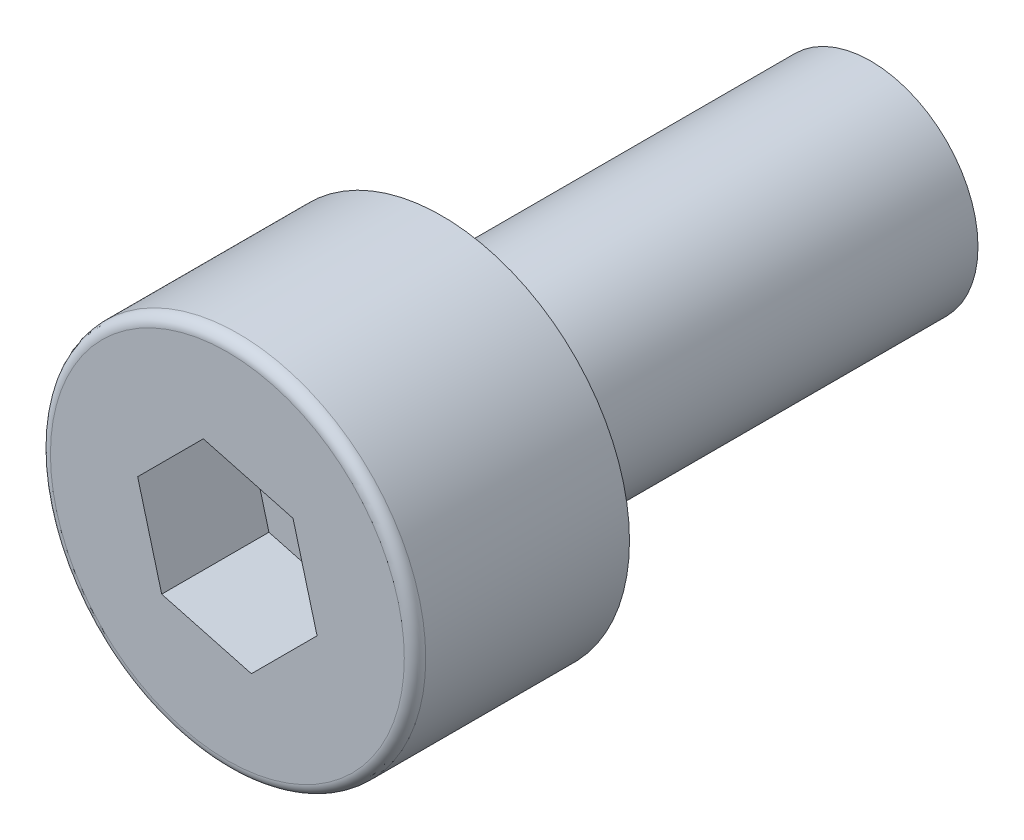
ISO-10303-21;
HEADER;
FILE_DESCRIPTION(('STEP AP214'),'2;1');
FILE_NAME('part.step','',(''),(''),'','','');
FILE_SCHEMA(('AUTOMOTIVE_DESIGN { 1 0 10303 214 1 1 1 1 }'));
ENDSEC;
DATA;
#1=APPLICATION_CONTEXT('core data for automotive mechanical design processes');
#2=APPLICATION_PROTOCOL_DEFINITION('international standard','automotive_design',2000,#1);
#3=PRODUCT_CONTEXT('',#1,'mechanical');
#4=PRODUCT('Part','Part','',(#3));
#5=PRODUCT_RELATED_PRODUCT_CATEGORY('part','',(#4));
#6=PRODUCT_DEFINITION_FORMATION('','',#4);
#7=PRODUCT_DEFINITION_CONTEXT('part definition',#1,'design');
#8=PRODUCT_DEFINITION('design','',#6,#7);
#9=PRODUCT_DEFINITION_SHAPE('','',#8);
#10=(LENGTH_UNIT() NAMED_UNIT(*) SI_UNIT(.MILLI.,.METRE.));
#11=(NAMED_UNIT(*) PLANE_ANGLE_UNIT() SI_UNIT($,.RADIAN.));
#12=(NAMED_UNIT(*) SI_UNIT($,.STERADIAN.) SOLID_ANGLE_UNIT());
#13=UNCERTAINTY_MEASURE_WITH_UNIT(LENGTH_MEASURE(1.E-05),#10,'distance_accuracy_value','');
#14=(GEOMETRIC_REPRESENTATION_CONTEXT(3) GLOBAL_UNCERTAINTY_ASSIGNED_CONTEXT((#13)) GLOBAL_UNIT_ASSIGNED_CONTEXT((#10,
#11,#12)) REPRESENTATION_CONTEXT('',''));
#15=CARTESIAN_POINT('',(0.,0.,0.));
#16=DIRECTION('',(0.,0.,1.));
#17=DIRECTION('',(1.,0.,0.));
#18=AXIS2_PLACEMENT_3D('',#15,#16,#17);
#19=CARTESIAN_POINT('',(0.,0.,0.));
#20=DIRECTION('',(0.,0.,1.));
#21=DIRECTION('',(1.,0.,0.));
#22=AXIS2_PLACEMENT_3D('',#19,#20,#21);
#23=PLANE('',#22);
#24=CARTESIAN_POINT('',(0.,0.,0.));
#25=DIRECTION('',(0.,0.,1.));
#26=DIRECTION('',(1.,0.,0.));
#27=AXIS2_PLACEMENT_3D('',#24,#25,#26);
#28=CIRCLE('',#27,3.5);
#29=CARTESIAN_POINT('',(3.5,0.,0.));
#30=VERTEX_POINT('',#29);
#31=EDGE_CURVE('E138',#30,#30,#28,.T.);
#32=ORIENTED_EDGE('',*,*,#31,.F.);
#33=EDGE_LOOP('',(#32));
#34=FACE_BOUND('',#33,.T.);
#35=CARTESIAN_POINT('',(0.,0.,0.));
#36=DIRECTION('',(0.,0.,1.));
#37=DIRECTION('',(1.,0.,0.));
#38=AXIS2_PLACEMENT_3D('',#35,#36,#37);
#39=CIRCLE('',#38,2.);
#40=CARTESIAN_POINT('',(2.,0.,0.));
#41=VERTEX_POINT('',#40);
#42=EDGE_CURVE('E146',#41,#41,#39,.F.);
#43=ORIENTED_EDGE('',*,*,#42,.F.);
#44=EDGE_LOOP('',(#43));
#45=FACE_BOUND('',#44,.T.);
#46=ADVANCED_FACE('F35',(#34,#45),#23,.F.);
#47=CARTESIAN_POINT('',(0.,0.,4.));
#48=DIRECTION('',(0.,0.,-1.));
#49=DIRECTION('',(-1.,0.,0.));
#50=AXIS2_PLACEMENT_3D('',#47,#48,#49);
#51=CYLINDRICAL_SURFACE('',#50,3.5);
#52=CARTESIAN_POINT('',(0.,0.,3.8));
#53=DIRECTION('',(0.,0.,1.));
#54=DIRECTION('',(1.,0.,0.));
#55=AXIS2_PLACEMENT_3D('',#52,#53,#54);
#56=CIRCLE('',#55,3.5);
#57=CARTESIAN_POINT('',(3.5,0.,3.8));
#58=VERTEX_POINT('',#57);
#59=EDGE_CURVE('E11',#58,#58,#56,.F.);
#60=ORIENTED_EDGE('',*,*,#59,.T.);
#61=EDGE_LOOP('',(#60));
#62=FACE_BOUND('',#61,.T.);
#63=ORIENTED_EDGE('',*,*,#31,.T.);
#64=EDGE_LOOP('',(#63));
#65=FACE_BOUND('',#64,.T.);
#66=ADVANCED_FACE('F165',(#62,#65),#51,.T.);
#67=CARTESIAN_POINT('',(0.,0.,4.));
#68=DIRECTION('',(0.,0.,1.));
#69=DIRECTION('',(1.,0.,0.));
#70=AXIS2_PLACEMENT_3D('',#67,#68,#69);
#71=PLANE('',#70);
#72=CARTESIAN_POINT('',(0.,0.,4.));
#73=DIRECTION('',(0.,0.,1.));
#74=DIRECTION('',(1.,0.,0.));
#75=AXIS2_PLACEMENT_3D('',#72,#73,#74);
#76=CIRCLE('',#75,3.3);
#77=CARTESIAN_POINT('',(3.3,0.,4.));
#78=VERTEX_POINT('',#77);
#79=EDGE_CURVE('E43',#78,#78,#76,.T.);
#80=ORIENTED_EDGE('',*,*,#79,.T.);
#81=EDGE_LOOP('',(#80));
#82=FACE_BOUND('',#81,.T.);
#83=DIRECTION('',(0.258819045102521,-0.965925826289068,0.));
#84=VECTOR('',#83,1.);
#85=CARTESIAN_POINT('',(-1.67303260747562,0.448287736084027,4.));
#86=LINE('',#85,#84);
#87=CARTESIAN_POINT('',(-1.67303260747562,0.448287736084027,4.));
#88=VERTEX_POINT('',#87);
#89=CARTESIAN_POINT('',(-1.22474487139159,-1.22474487139159,4.));
#90=VERTEX_POINT('',#89);
#91=EDGE_CURVE('E50',#88,#90,#86,.T.);
#92=ORIENTED_EDGE('',*,*,#91,.F.);
#93=DIRECTION('',(-0.707106781186547,-0.707106781186548,0.));
#94=VECTOR('',#93,1.);
#95=CARTESIAN_POINT('',(-0.448287736084027,1.67303260747562,4.));
#96=LINE('',#95,#94);
#97=CARTESIAN_POINT('',(-0.448287736084027,1.67303260747562,4.));
#98=VERTEX_POINT('',#97);
#99=EDGE_CURVE('E134',#98,#88,#96,.T.);
#100=ORIENTED_EDGE('',*,*,#99,.F.);
#101=DIRECTION('',(-0.965925826289068,0.258819045102521,0.));
#102=VECTOR('',#101,1.);
#103=CARTESIAN_POINT('',(1.22474487139159,1.22474487139159,4.));
#104=LINE('',#103,#102);
#105=CARTESIAN_POINT('',(1.22474487139159,1.22474487139159,4.));
#106=VERTEX_POINT('',#105);
#107=EDGE_CURVE('E132',#106,#98,#104,.T.);
#108=ORIENTED_EDGE('',*,*,#107,.F.);
#109=DIRECTION('',(-0.258819045102521,0.965925826289068,0.));
#110=VECTOR('',#109,1.);
#111=CARTESIAN_POINT('',(1.67303260747562,-0.448287736084027,4.));
#112=LINE('',#111,#110);
#113=CARTESIAN_POINT('',(1.67303260747562,-0.448287736084027,4.));
#114=VERTEX_POINT('',#113);
#115=EDGE_CURVE('E98',#114,#106,#112,.T.);
#116=ORIENTED_EDGE('',*,*,#115,.F.);
#117=DIRECTION('',(0.707106781186547,0.707106781186548,0.));
#118=VECTOR('',#117,1.);
#119=CARTESIAN_POINT('',(0.448287736084026,-1.67303260747562,4.));
#120=LINE('',#119,#118);
#121=CARTESIAN_POINT('',(0.448287736084026,-1.67303260747562,4.));
#122=VERTEX_POINT('',#121);
#123=EDGE_CURVE('E128',#122,#114,#120,.T.);
#124=ORIENTED_EDGE('',*,*,#123,.F.);
#125=DIRECTION('',(0.965925826289068,-0.258819045102521,0.));
#126=VECTOR('',#125,1.);
#127=CARTESIAN_POINT('',(-1.22474487139159,-1.22474487139159,4.));
#128=LINE('',#127,#126);
#129=EDGE_CURVE('E124',#90,#122,#128,.T.);
#130=ORIENTED_EDGE('',*,*,#129,.F.);
#131=EDGE_LOOP('',(#92,#100,#108,#116,#124,#130));
#132=FACE_BOUND('',#131,.T.);
#133=ADVANCED_FACE('F151',(#82,#132),#71,.T.);
#134=CARTESIAN_POINT('',(-1.67303260747562,0.448287736084027,2.));
#135=DIRECTION('',(-0.965925826289068,-0.258819045102521,0.));
#136=DIRECTION('',(0.258819045102521,-0.965925826289068,0.));
#137=AXIS2_PLACEMENT_3D('',#134,#135,#136);
#138=PLANE('',#137);
#139=ORIENTED_EDGE('',*,*,#91,.T.);
#140=DIRECTION('',(0.,0.,1.));
#141=VECTOR('',#140,1.);
#142=CARTESIAN_POINT('',(-1.22474487139159,-1.22474487139159,2.));
#143=LINE('',#142,#141);
#144=CARTESIAN_POINT('',(-1.22474487139159,-1.22474487139159,2.));
#145=VERTEX_POINT('',#144);
#146=EDGE_CURVE('E80',#145,#90,#143,.T.);
#147=ORIENTED_EDGE('',*,*,#146,.F.);
#148=DIRECTION('',(0.258819045102521,-0.965925826289068,0.));
#149=VECTOR('',#148,1.);
#150=CARTESIAN_POINT('',(-1.67303260747562,0.448287736084027,2.));
#151=LINE('',#150,#149);
#152=CARTESIAN_POINT('',(-1.67303260747562,0.448287736084027,2.));
#153=VERTEX_POINT('',#152);
#154=EDGE_CURVE('E136',#153,#145,#151,.T.);
#155=ORIENTED_EDGE('',*,*,#154,.F.);
#156=DIRECTION('',(0.,0.,1.));
#157=VECTOR('',#156,1.);
#158=CARTESIAN_POINT('',(-1.67303260747562,0.448287736084027,2.));
#159=LINE('',#158,#157);
#160=EDGE_CURVE('E58',#153,#88,#159,.T.);
#161=ORIENTED_EDGE('',*,*,#160,.T.);
#162=EDGE_LOOP('',(#139,#147,#155,#161));
#163=FACE_BOUND('',#162,.T.);
#164=ADVANCED_FACE('F177',(#163),#138,.F.);
#165=CARTESIAN_POINT('',(-0.448287736084027,1.67303260747562,2.));
#166=DIRECTION('',(-0.707106781186548,0.707106781186547,0.));
#167=DIRECTION('',(-0.707106781186547,-0.707106781186548,0.));
#168=AXIS2_PLACEMENT_3D('',#165,#166,#167);
#169=PLANE('',#168);
#170=ORIENTED_EDGE('',*,*,#99,.T.);
#171=ORIENTED_EDGE('',*,*,#160,.F.);
#172=DIRECTION('',(-0.707106781186547,-0.707106781186548,0.));
#173=VECTOR('',#172,1.);
#174=CARTESIAN_POINT('',(-0.448287736084027,1.67303260747562,2.));
#175=LINE('',#174,#173);
#176=CARTESIAN_POINT('',(-0.448287736084027,1.67303260747562,2.));
#177=VERTEX_POINT('',#176);
#178=EDGE_CURVE('E110',#177,#153,#175,.T.);
#179=ORIENTED_EDGE('',*,*,#178,.F.);
#180=DIRECTION('',(0.,0.,1.));
#181=VECTOR('',#180,1.);
#182=CARTESIAN_POINT('',(-0.448287736084027,1.67303260747562,2.));
#183=LINE('',#182,#181);
#184=EDGE_CURVE('E102',#177,#98,#183,.T.);
#185=ORIENTED_EDGE('',*,*,#184,.T.);
#186=EDGE_LOOP('',(#170,#171,#179,#185));
#187=FACE_BOUND('',#186,.T.);
#188=ADVANCED_FACE('F180',(#187),#169,.F.);
#189=CARTESIAN_POINT('',(1.22474487139159,1.22474487139159,2.));
#190=DIRECTION('',(0.258819045102521,0.965925826289068,0.));
#191=DIRECTION('',(-0.965925826289068,0.258819045102521,0.));
#192=AXIS2_PLACEMENT_3D('',#189,#190,#191);
#193=PLANE('',#192);
#194=ORIENTED_EDGE('',*,*,#107,.T.);
#195=ORIENTED_EDGE('',*,*,#184,.F.);
#196=DIRECTION('',(-0.965925826289068,0.258819045102521,0.));
#197=VECTOR('',#196,1.);
#198=CARTESIAN_POINT('',(1.22474487139159,1.22474487139159,2.));
#199=LINE('',#198,#197);
#200=CARTESIAN_POINT('',(1.22474487139159,1.22474487139159,2.));
#201=VERTEX_POINT('',#200);
#202=EDGE_CURVE('E106',#201,#177,#199,.T.);
#203=ORIENTED_EDGE('',*,*,#202,.F.);
#204=DIRECTION('',(0.,0.,1.));
#205=VECTOR('',#204,1.);
#206=CARTESIAN_POINT('',(1.22474487139159,1.22474487139159,2.));
#207=LINE('',#206,#205);
#208=EDGE_CURVE('E91',#201,#106,#207,.T.);
#209=ORIENTED_EDGE('',*,*,#208,.T.);
#210=EDGE_LOOP('',(#194,#195,#203,#209));
#211=FACE_BOUND('',#210,.T.);
#212=ADVANCED_FACE('F107',(#211),#193,.F.);
#213=CARTESIAN_POINT('',(1.67303260747562,-0.448287736084027,2.));
#214=DIRECTION('',(0.965925826289068,0.258819045102521,0.));
#215=DIRECTION('',(-0.258819045102521,0.965925826289068,0.));
#216=AXIS2_PLACEMENT_3D('',#213,#214,#215);
#217=PLANE('',#216);
#218=ORIENTED_EDGE('',*,*,#115,.T.);
#219=ORIENTED_EDGE('',*,*,#208,.F.);
#220=DIRECTION('',(-0.258819045102521,0.965925826289068,0.));
#221=VECTOR('',#220,1.);
#222=CARTESIAN_POINT('',(1.67303260747562,-0.448287736084027,2.));
#223=LINE('',#222,#221);
#224=CARTESIAN_POINT('',(1.67303260747562,-0.448287736084027,2.));
#225=VERTEX_POINT('',#224);
#226=EDGE_CURVE('E95',#225,#201,#223,.T.);
#227=ORIENTED_EDGE('',*,*,#226,.F.);
#228=DIRECTION('',(0.,0.,1.));
#229=VECTOR('',#228,1.);
#230=CARTESIAN_POINT('',(1.67303260747562,-0.448287736084027,2.));
#231=LINE('',#230,#229);
#232=EDGE_CURVE('E103',#225,#114,#231,.T.);
#233=ORIENTED_EDGE('',*,*,#232,.T.);
#234=EDGE_LOOP('',(#218,#219,#227,#233));
#235=FACE_BOUND('',#234,.T.);
#236=ADVANCED_FACE('F93',(#235),#217,.F.);
#237=CARTESIAN_POINT('',(0.448287736084026,-1.67303260747562,2.));
#238=DIRECTION('',(0.707106781186548,-0.707106781186547,0.));
#239=DIRECTION('',(0.707106781186547,0.707106781186548,0.));
#240=AXIS2_PLACEMENT_3D('',#237,#238,#239);
#241=PLANE('',#240);
#242=ORIENTED_EDGE('',*,*,#123,.T.);
#243=ORIENTED_EDGE('',*,*,#232,.F.);
#244=DIRECTION('',(0.707106781186547,0.707106781186548,0.));
#245=VECTOR('',#244,1.);
#246=CARTESIAN_POINT('',(0.448287736084026,-1.67303260747562,2.));
#247=LINE('',#246,#245);
#248=CARTESIAN_POINT('',(0.448287736084026,-1.67303260747562,2.));
#249=VERTEX_POINT('',#248);
#250=EDGE_CURVE('E116',#249,#225,#247,.T.);
#251=ORIENTED_EDGE('',*,*,#250,.F.);
#252=DIRECTION('',(0.,0.,1.));
#253=VECTOR('',#252,1.);
#254=CARTESIAN_POINT('',(0.448287736084026,-1.67303260747562,2.));
#255=LINE('',#254,#253);
#256=EDGE_CURVE('E141',#249,#122,#255,.T.);
#257=ORIENTED_EDGE('',*,*,#256,.T.);
#258=EDGE_LOOP('',(#242,#243,#251,#257));
#259=FACE_BOUND('',#258,.T.);
#260=ADVANCED_FACE('F184',(#259),#241,.F.);
#261=CARTESIAN_POINT('',(-1.22474487139159,-1.22474487139159,2.));
#262=DIRECTION('',(-0.258819045102521,-0.965925826289068,0.));
#263=DIRECTION('',(0.965925826289068,-0.258819045102521,0.));
#264=AXIS2_PLACEMENT_3D('',#261,#262,#263);
#265=PLANE('',#264);
#266=ORIENTED_EDGE('',*,*,#129,.T.);
#267=ORIENTED_EDGE('',*,*,#256,.F.);
#268=DIRECTION('',(0.965925826289068,-0.258819045102521,0.));
#269=VECTOR('',#268,1.);
#270=CARTESIAN_POINT('',(-1.22474487139159,-1.22474487139159,2.));
#271=LINE('',#270,#269);
#272=EDGE_CURVE('E118',#145,#249,#271,.T.);
#273=ORIENTED_EDGE('',*,*,#272,.F.);
#274=ORIENTED_EDGE('',*,*,#146,.T.);
#275=EDGE_LOOP('',(#266,#267,#273,#274));
#276=FACE_BOUND('',#275,.T.);
#277=ADVANCED_FACE('F181',(#276),#265,.F.);
#278=CARTESIAN_POINT('',(0.,0.,2.));
#279=DIRECTION('',(0.,0.,1.));
#280=DIRECTION('',(1.,0.,0.));
#281=AXIS2_PLACEMENT_3D('',#278,#279,#280);
#282=PLANE('',#281);
#283=ORIENTED_EDGE('',*,*,#154,.T.);
#284=ORIENTED_EDGE('',*,*,#272,.T.);
#285=ORIENTED_EDGE('',*,*,#250,.T.);
#286=ORIENTED_EDGE('',*,*,#226,.T.);
#287=ORIENTED_EDGE('',*,*,#202,.T.);
#288=ORIENTED_EDGE('',*,*,#178,.T.);
#289=EDGE_LOOP('',(#283,#284,#285,#286,#287,#288));
#290=FACE_BOUND('',#289,.T.);
#291=ADVANCED_FACE('F113',(#290),#282,.T.);
#292=CARTESIAN_POINT('',(0.,0.,-8.));
#293=DIRECTION('',(0.,0.,1.));
#294=DIRECTION('',(1.,0.,0.));
#295=AXIS2_PLACEMENT_3D('',#292,#293,#294);
#296=CYLINDRICAL_SURFACE('',#295,2.);
#297=CARTESIAN_POINT('',(0.,0.,-8.));
#298=DIRECTION('',(0.,0.,-1.));
#299=DIRECTION('',(-1.,0.,0.));
#300=AXIS2_PLACEMENT_3D('',#297,#298,#299);
#301=CIRCLE('',#300,2.);
#302=CARTESIAN_POINT('',(-2.,0.,-8.));
#303=VERTEX_POINT('',#302);
#304=EDGE_CURVE('E125',#303,#303,#301,.T.);
#305=ORIENTED_EDGE('',*,*,#304,.F.);
#306=EDGE_LOOP('',(#305));
#307=FACE_BOUND('',#306,.T.);
#308=ORIENTED_EDGE('',*,*,#42,.T.);
#309=EDGE_LOOP('',(#308));
#310=FACE_BOUND('',#309,.T.);
#311=ADVANCED_FACE('F160',(#307,#310),#296,.T.);
#312=CARTESIAN_POINT('',(0.,0.,-8.));
#313=DIRECTION('',(0.,0.,-1.));
#314=DIRECTION('',(-1.,0.,0.));
#315=AXIS2_PLACEMENT_3D('',#312,#313,#314);
#316=PLANE('',#315);
#317=ORIENTED_EDGE('',*,*,#304,.T.);
#318=EDGE_LOOP('',(#317));
#319=FACE_BOUND('',#318,.T.);
#320=ADVANCED_FACE('F155',(#319),#316,.T.);
#321=CARTESIAN_POINT('',(0.,0.,3.8));
#322=DIRECTION('',(0.,0.,1.));
#323=DIRECTION('',(1.,0.,0.));
#324=AXIS2_PLACEMENT_3D('',#321,#322,#323);
#325=TOROIDAL_SURFACE('',#324,3.3,0.2);
#326=ORIENTED_EDGE('',*,*,#59,.F.);
#327=EDGE_LOOP('',(#326));
#328=FACE_BOUND('',#327,.T.);
#329=ORIENTED_EDGE('',*,*,#79,.F.);
#330=EDGE_LOOP('',(#329));
#331=FACE_BOUND('',#330,.T.);
#332=ADVANCED_FACE('F37',(#328,#331),#325,.T.);
#333=CLOSED_SHELL('',(#46,#66,#133,#164,#188,#212,#236,#260,#277,#291,#311,#320,#332));
#334=MANIFOLD_SOLID_BREP('B2',#333);
#335=ADVANCED_BREP_SHAPE_REPRESENTATION('',(#18,#334),#14);
#336=SHAPE_DEFINITION_REPRESENTATION(#9,#335);
ENDSEC;
END-ISO-10303-21;
